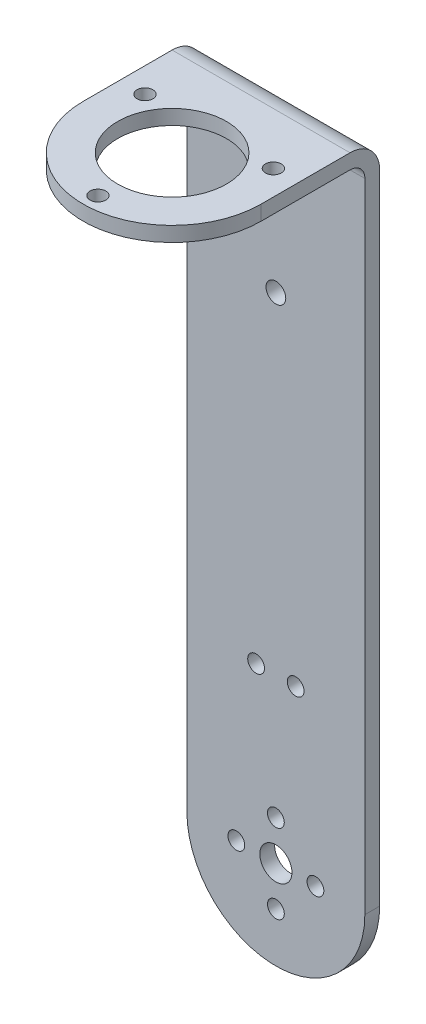
ISO-10303-21;
HEADER;
FILE_DESCRIPTION(('STEP AP214'),'2;1');
FILE_NAME('part.step','',(''),(''),'','','');
FILE_SCHEMA(('AUTOMOTIVE_DESIGN { 1 0 10303 214 1 1 1 1 }'));
ENDSEC;
DATA;
#1=APPLICATION_CONTEXT('core data for automotive mechanical design processes');
#2=APPLICATION_PROTOCOL_DEFINITION('international standard','automotive_design',2000,#1);
#3=PRODUCT_CONTEXT('',#1,'mechanical');
#4=PRODUCT('Part','Part','',(#3));
#5=PRODUCT_RELATED_PRODUCT_CATEGORY('part','',(#4));
#6=PRODUCT_DEFINITION_FORMATION('','',#4);
#7=PRODUCT_DEFINITION_CONTEXT('part definition',#1,'design');
#8=PRODUCT_DEFINITION('design','',#6,#7);
#9=PRODUCT_DEFINITION_SHAPE('','',#8);
#10=(LENGTH_UNIT() NAMED_UNIT(*) SI_UNIT(.MILLI.,.METRE.));
#11=(NAMED_UNIT(*) PLANE_ANGLE_UNIT() SI_UNIT($,.RADIAN.));
#12=(NAMED_UNIT(*) SI_UNIT($,.STERADIAN.) SOLID_ANGLE_UNIT());
#13=UNCERTAINTY_MEASURE_WITH_UNIT(LENGTH_MEASURE(1.E-05),#10,'distance_accuracy_value','');
#14=(GEOMETRIC_REPRESENTATION_CONTEXT(3) GLOBAL_UNCERTAINTY_ASSIGNED_CONTEXT((#13)) GLOBAL_UNIT_ASSIGNED_CONTEXT((#10,
#11,#12)) REPRESENTATION_CONTEXT('',''));
#15=CARTESIAN_POINT('',(0.,0.,0.));
#16=DIRECTION('',(0.,0.,1.));
#17=DIRECTION('',(1.,0.,0.));
#18=AXIS2_PLACEMENT_3D('',#15,#16,#17);
#19=CARTESIAN_POINT('',(0.,0.,3.));
#20=DIRECTION('',(0.,0.,-1.));
#21=DIRECTION('',(-1.,0.,0.));
#22=AXIS2_PLACEMENT_3D('',#19,#20,#21);
#23=PLANE('',#22);
#24=DIRECTION('',(0.,1.,0.));
#25=VECTOR('',#24,1.);
#26=CARTESIAN_POINT('',(18.,135.,3.));
#27=LINE('',#26,#25);
#28=CARTESIAN_POINT('',(18.,0.,3.));
#29=VERTEX_POINT('',#28);
#30=CARTESIAN_POINT('',(18.,129.,3.));
#31=VERTEX_POINT('',#30);
#32=EDGE_CURVE('E188',#29,#31,#27,.T.);
#33=ORIENTED_EDGE('',*,*,#32,.T.);
#34=DIRECTION('',(-1.,0.,0.));
#35=VECTOR('',#34,1.);
#36=CARTESIAN_POINT('',(0.,129.,3.));
#37=LINE('',#36,#35);
#38=CARTESIAN_POINT('',(-18.,129.,3.));
#39=VERTEX_POINT('',#38);
#40=EDGE_CURVE('E210',#31,#39,#37,.T.);
#41=ORIENTED_EDGE('',*,*,#40,.T.);
#42=DIRECTION('',(0.,-1.,0.));
#43=VECTOR('',#42,1.);
#44=CARTESIAN_POINT('',(-18.,0.,3.));
#45=LINE('',#44,#43);
#46=CARTESIAN_POINT('',(-18.,0.,3.));
#47=VERTEX_POINT('',#46);
#48=EDGE_CURVE('E192',#39,#47,#45,.T.);
#49=ORIENTED_EDGE('',*,*,#48,.T.);
#50=CARTESIAN_POINT('',(0.,0.,3.));
#51=DIRECTION('',(0.,0.,1.));
#52=DIRECTION('',(-1.,0.,0.));
#53=AXIS2_PLACEMENT_3D('',#50,#51,#52);
#54=CIRCLE('',#53,18.);
#55=EDGE_CURVE('E185',#47,#29,#54,.T.);
#56=ORIENTED_EDGE('',*,*,#55,.T.);
#57=EDGE_LOOP('',(#33,#41,#49,#56));
#58=FACE_BOUND('',#57,.T.);
#59=CARTESIAN_POINT('',(0.,0.,3.));
#60=DIRECTION('',(0.,0.,1.));
#61=DIRECTION('',(1.,0.,0.));
#62=AXIS2_PLACEMENT_3D('',#59,#60,#61);
#63=CIRCLE('',#62,3.25);
#64=CARTESIAN_POINT('',(3.25,0.,3.));
#65=VERTEX_POINT('',#64);
#66=EDGE_CURVE('E179',#65,#65,#63,.T.);
#67=ORIENTED_EDGE('',*,*,#66,.F.);
#68=EDGE_LOOP('',(#67));
#69=FACE_BOUND('',#68,.T.);
#70=CARTESIAN_POINT('',(-8.,0.,3.));
#71=DIRECTION('',(0.,0.,1.));
#72=DIRECTION('',(1.,0.,0.));
#73=AXIS2_PLACEMENT_3D('',#70,#71,#72);
#74=CIRCLE('',#73,1.7);
#75=CARTESIAN_POINT('',(-6.3,0.,3.));
#76=VERTEX_POINT('',#75);
#77=EDGE_CURVE('E173',#76,#76,#74,.T.);
#78=ORIENTED_EDGE('',*,*,#77,.F.);
#79=EDGE_LOOP('',(#78));
#80=FACE_BOUND('',#79,.T.);
#81=CARTESIAN_POINT('',(8.,0.,3.));
#82=DIRECTION('',(0.,0.,1.));
#83=DIRECTION('',(1.,0.,0.));
#84=AXIS2_PLACEMENT_3D('',#81,#82,#83);
#85=CIRCLE('',#84,1.7);
#86=CARTESIAN_POINT('',(9.7,0.,3.));
#87=VERTEX_POINT('',#86);
#88=EDGE_CURVE('E167',#87,#87,#85,.T.);
#89=ORIENTED_EDGE('',*,*,#88,.F.);
#90=EDGE_LOOP('',(#89));
#91=FACE_BOUND('',#90,.T.);
#92=CARTESIAN_POINT('',(0.,-8.,3.));
#93=DIRECTION('',(0.,0.,1.));
#94=DIRECTION('',(1.,0.,0.));
#95=AXIS2_PLACEMENT_3D('',#92,#93,#94);
#96=CIRCLE('',#95,1.7);
#97=CARTESIAN_POINT('',(1.7,-8.,3.));
#98=VERTEX_POINT('',#97);
#99=EDGE_CURVE('E161',#98,#98,#96,.T.);
#100=ORIENTED_EDGE('',*,*,#99,.F.);
#101=EDGE_LOOP('',(#100));
#102=FACE_BOUND('',#101,.T.);
#103=CARTESIAN_POINT('',(0.,8.,3.));
#104=DIRECTION('',(0.,0.,1.));
#105=DIRECTION('',(1.,0.,0.));
#106=AXIS2_PLACEMENT_3D('',#103,#104,#105);
#107=CIRCLE('',#106,1.7);
#108=CARTESIAN_POINT('',(1.7,8.,3.));
#109=VERTEX_POINT('',#108);
#110=EDGE_CURVE('E155',#109,#109,#107,.T.);
#111=ORIENTED_EDGE('',*,*,#110,.F.);
#112=EDGE_LOOP('',(#111));
#113=FACE_BOUND('',#112,.T.);
#114=CARTESIAN_POINT('',(-4.,33.,3.));
#115=DIRECTION('',(0.,0.,1.));
#116=DIRECTION('',(1.,0.,0.));
#117=AXIS2_PLACEMENT_3D('',#114,#115,#116);
#118=CIRCLE('',#117,1.7);
#119=CARTESIAN_POINT('',(-2.3,33.,3.));
#120=VERTEX_POINT('',#119);
#121=EDGE_CURVE('E149',#120,#120,#118,.T.);
#122=ORIENTED_EDGE('',*,*,#121,.F.);
#123=EDGE_LOOP('',(#122));
#124=FACE_BOUND('',#123,.T.);
#125=CARTESIAN_POINT('',(4.,33.,3.));
#126=DIRECTION('',(0.,0.,1.));
#127=DIRECTION('',(1.,0.,0.));
#128=AXIS2_PLACEMENT_3D('',#125,#126,#127);
#129=CIRCLE('',#128,1.7);
#130=CARTESIAN_POINT('',(5.7,33.,3.));
#131=VERTEX_POINT('',#130);
#132=EDGE_CURVE('E143',#131,#131,#129,.T.);
#133=ORIENTED_EDGE('',*,*,#132,.F.);
#134=EDGE_LOOP('',(#133));
#135=FACE_BOUND('',#134,.T.);
#136=CARTESIAN_POINT('',(0.,100.,3.));
#137=DIRECTION('',(0.,0.,1.));
#138=DIRECTION('',(1.,0.,0.));
#139=AXIS2_PLACEMENT_3D('',#136,#137,#138);
#140=CIRCLE('',#139,2.);
#141=CARTESIAN_POINT('',(2.,100.,3.));
#142=VERTEX_POINT('',#141);
#143=EDGE_CURVE('E137',#142,#142,#140,.T.);
#144=ORIENTED_EDGE('',*,*,#143,.F.);
#145=EDGE_LOOP('',(#144));
#146=FACE_BOUND('',#145,.T.);
#147=ADVANCED_FACE('F43',(#58,#69,#80,#91,#102,#113,#124,#135,#146),#23,.F.);
#148=CARTESIAN_POINT('',(0.,0.,0.));
#149=DIRECTION('',(0.,0.,-1.));
#150=DIRECTION('',(-1.,0.,0.));
#151=AXIS2_PLACEMENT_3D('',#148,#149,#150);
#152=PLANE('',#151);
#153=DIRECTION('',(0.,-1.,0.));
#154=VECTOR('',#153,1.);
#155=CARTESIAN_POINT('',(-18.,0.,0.));
#156=LINE('',#155,#154);
#157=CARTESIAN_POINT('',(-18.,129.,0.));
#158=VERTEX_POINT('',#157);
#159=CARTESIAN_POINT('',(-18.,0.,0.));
#160=VERTEX_POINT('',#159);
#161=EDGE_CURVE('E189',#158,#160,#156,.T.);
#162=ORIENTED_EDGE('',*,*,#161,.F.);
#163=DIRECTION('',(-1.,0.,0.));
#164=VECTOR('',#163,1.);
#165=CARTESIAN_POINT('',(18.,129.,0.));
#166=LINE('',#165,#164);
#167=CARTESIAN_POINT('',(18.,129.,0.));
#168=VERTEX_POINT('',#167);
#169=EDGE_CURVE('E51',#158,#168,#166,.F.);
#170=ORIENTED_EDGE('',*,*,#169,.T.);
#171=DIRECTION('',(0.,1.,0.));
#172=VECTOR('',#171,1.);
#173=CARTESIAN_POINT('',(18.,135.,0.));
#174=LINE('',#173,#172);
#175=CARTESIAN_POINT('',(18.,0.,0.));
#176=VERTEX_POINT('',#175);
#177=EDGE_CURVE('E197',#176,#168,#174,.T.);
#178=ORIENTED_EDGE('',*,*,#177,.F.);
#179=CARTESIAN_POINT('',(0.,0.,0.));
#180=DIRECTION('',(0.,0.,1.));
#181=DIRECTION('',(-1.,0.,0.));
#182=AXIS2_PLACEMENT_3D('',#179,#180,#181);
#183=CIRCLE('',#182,18.);
#184=EDGE_CURVE('E182',#160,#176,#183,.T.);
#185=ORIENTED_EDGE('',*,*,#184,.F.);
#186=EDGE_LOOP('',(#162,#170,#178,#185));
#187=FACE_BOUND('',#186,.T.);
#188=CARTESIAN_POINT('',(4.,33.,0.));
#189=DIRECTION('',(0.,0.,1.));
#190=DIRECTION('',(1.,0.,0.));
#191=AXIS2_PLACEMENT_3D('',#188,#189,#190);
#192=CIRCLE('',#191,1.7);
#193=CARTESIAN_POINT('',(5.7,33.,0.));
#194=VERTEX_POINT('',#193);
#195=EDGE_CURVE('E140',#194,#194,#192,.T.);
#196=ORIENTED_EDGE('',*,*,#195,.T.);
#197=EDGE_LOOP('',(#196));
#198=FACE_BOUND('',#197,.T.);
#199=CARTESIAN_POINT('',(0.,8.,0.));
#200=DIRECTION('',(0.,0.,1.));
#201=DIRECTION('',(1.,0.,0.));
#202=AXIS2_PLACEMENT_3D('',#199,#200,#201);
#203=CIRCLE('',#202,1.7);
#204=CARTESIAN_POINT('',(1.7,8.,0.));
#205=VERTEX_POINT('',#204);
#206=EDGE_CURVE('E152',#205,#205,#203,.T.);
#207=ORIENTED_EDGE('',*,*,#206,.T.);
#208=EDGE_LOOP('',(#207));
#209=FACE_BOUND('',#208,.T.);
#210=CARTESIAN_POINT('',(8.,0.,0.));
#211=DIRECTION('',(0.,0.,1.));
#212=DIRECTION('',(1.,0.,0.));
#213=AXIS2_PLACEMENT_3D('',#210,#211,#212);
#214=CIRCLE('',#213,1.7);
#215=CARTESIAN_POINT('',(9.7,0.,0.));
#216=VERTEX_POINT('',#215);
#217=EDGE_CURVE('E164',#216,#216,#214,.T.);
#218=ORIENTED_EDGE('',*,*,#217,.T.);
#219=EDGE_LOOP('',(#218));
#220=FACE_BOUND('',#219,.T.);
#221=CARTESIAN_POINT('',(0.,0.,0.));
#222=DIRECTION('',(0.,0.,1.));
#223=DIRECTION('',(1.,0.,0.));
#224=AXIS2_PLACEMENT_3D('',#221,#222,#223);
#225=CIRCLE('',#224,3.25);
#226=CARTESIAN_POINT('',(3.25,0.,0.));
#227=VERTEX_POINT('',#226);
#228=EDGE_CURVE('E176',#227,#227,#225,.T.);
#229=ORIENTED_EDGE('',*,*,#228,.T.);
#230=EDGE_LOOP('',(#229));
#231=FACE_BOUND('',#230,.T.);
#232=CARTESIAN_POINT('',(-8.,0.,0.));
#233=DIRECTION('',(0.,0.,1.));
#234=DIRECTION('',(1.,0.,0.));
#235=AXIS2_PLACEMENT_3D('',#232,#233,#234);
#236=CIRCLE('',#235,1.7);
#237=CARTESIAN_POINT('',(-6.3,0.,0.));
#238=VERTEX_POINT('',#237);
#239=EDGE_CURVE('E170',#238,#238,#236,.T.);
#240=ORIENTED_EDGE('',*,*,#239,.T.);
#241=EDGE_LOOP('',(#240));
#242=FACE_BOUND('',#241,.T.);
#243=CARTESIAN_POINT('',(0.,-8.,0.));
#244=DIRECTION('',(0.,0.,1.));
#245=DIRECTION('',(1.,0.,0.));
#246=AXIS2_PLACEMENT_3D('',#243,#244,#245);
#247=CIRCLE('',#246,1.7);
#248=CARTESIAN_POINT('',(1.7,-8.,0.));
#249=VERTEX_POINT('',#248);
#250=EDGE_CURVE('E158',#249,#249,#247,.T.);
#251=ORIENTED_EDGE('',*,*,#250,.T.);
#252=EDGE_LOOP('',(#251));
#253=FACE_BOUND('',#252,.T.);
#254=CARTESIAN_POINT('',(-4.,33.,0.));
#255=DIRECTION('',(0.,0.,1.));
#256=DIRECTION('',(1.,0.,0.));
#257=AXIS2_PLACEMENT_3D('',#254,#255,#256);
#258=CIRCLE('',#257,1.7);
#259=CARTESIAN_POINT('',(-2.3,33.,0.));
#260=VERTEX_POINT('',#259);
#261=EDGE_CURVE('E146',#260,#260,#258,.T.);
#262=ORIENTED_EDGE('',*,*,#261,.T.);
#263=EDGE_LOOP('',(#262));
#264=FACE_BOUND('',#263,.T.);
#265=CARTESIAN_POINT('',(0.,100.,0.));
#266=DIRECTION('',(0.,0.,1.));
#267=DIRECTION('',(1.,0.,0.));
#268=AXIS2_PLACEMENT_3D('',#265,#266,#267);
#269=CIRCLE('',#268,2.);
#270=CARTESIAN_POINT('',(2.,100.,0.));
#271=VERTEX_POINT('',#270);
#272=EDGE_CURVE('E135',#271,#271,#269,.T.);
#273=ORIENTED_EDGE('',*,*,#272,.T.);
#274=EDGE_LOOP('',(#273));
#275=FACE_BOUND('',#274,.T.);
#276=ADVANCED_FACE('F231',(#187,#198,#209,#220,#231,#242,#253,#264,#275),#152,.T.);
#277=CARTESIAN_POINT('',(0.,0.,3.));
#278=DIRECTION('',(0.,0.,-1.));
#279=DIRECTION('',(-1.,0.,0.));
#280=AXIS2_PLACEMENT_3D('',#277,#278,#279);
#281=CYLINDRICAL_SURFACE('',#280,18.);
#282=ORIENTED_EDGE('',*,*,#184,.T.);
#283=DIRECTION('',(0.,0.,-1.));
#284=VECTOR('',#283,1.);
#285=CARTESIAN_POINT('',(18.,0.,3.));
#286=LINE('',#285,#284);
#287=EDGE_CURVE('E207',#29,#176,#286,.T.);
#288=ORIENTED_EDGE('',*,*,#287,.F.);
#289=ORIENTED_EDGE('',*,*,#55,.F.);
#290=DIRECTION('',(0.,0.,-1.));
#291=VECTOR('',#290,1.);
#292=CARTESIAN_POINT('',(-18.,0.,3.));
#293=LINE('',#292,#291);
#294=EDGE_CURVE('E194',#47,#160,#293,.T.);
#295=ORIENTED_EDGE('',*,*,#294,.T.);
#296=EDGE_LOOP('',(#282,#288,#289,#295));
#297=FACE_BOUND('',#296,.T.);
#298=ADVANCED_FACE('F234',(#297),#281,.T.);
#299=CARTESIAN_POINT('',(18.,135.,3.));
#300=DIRECTION('',(-1.,0.,0.));
#301=DIRECTION('',(0.,0.,1.));
#302=AXIS2_PLACEMENT_3D('',#299,#300,#301);
#303=PLANE('',#302);
#304=ORIENTED_EDGE('',*,*,#177,.T.);
#305=CARTESIAN_POINT('',(18.,129.,6.));
#306=DIRECTION('',(-1.,0.,0.));
#307=DIRECTION('',(0.,0.,1.));
#308=AXIS2_PLACEMENT_3D('',#305,#306,#307);
#309=CIRCLE('',#308,6.);
#310=CARTESIAN_POINT('',(18.,135.,6.));
#311=VERTEX_POINT('',#310);
#312=EDGE_CURVE('E11',#168,#311,#309,.F.);
#313=ORIENTED_EDGE('',*,*,#312,.T.);
#314=DIRECTION('',(0.,0.,-1.));
#315=VECTOR('',#314,1.);
#316=CARTESIAN_POINT('',(18.,135.,3.));
#317=LINE('',#316,#315);
#318=CARTESIAN_POINT('',(18.,135.,24.));
#319=VERTEX_POINT('',#318);
#320=EDGE_CURVE('E204',#319,#311,#317,.T.);
#321=ORIENTED_EDGE('',*,*,#320,.F.);
#322=DIRECTION('',(0.,1.,0.));
#323=VECTOR('',#322,1.);
#324=CARTESIAN_POINT('',(18.,132.,24.));
#325=LINE('',#324,#323);
#326=CARTESIAN_POINT('',(18.,132.,24.));
#327=VERTEX_POINT('',#326);
#328=EDGE_CURVE('E123',#327,#319,#325,.T.);
#329=ORIENTED_EDGE('',*,*,#328,.F.);
#330=DIRECTION('',(0.,0.,-1.));
#331=VECTOR('',#330,1.);
#332=CARTESIAN_POINT('',(18.,132.,0.));
#333=LINE('',#332,#331);
#334=CARTESIAN_POINT('',(18.,132.,6.));
#335=VERTEX_POINT('',#334);
#336=EDGE_CURVE('E124',#327,#335,#333,.T.);
#337=ORIENTED_EDGE('',*,*,#336,.T.);
#338=CARTESIAN_POINT('',(18.,129.,6.));
#339=DIRECTION('',(-1.,0.,0.));
#340=DIRECTION('',(0.,0.,1.));
#341=AXIS2_PLACEMENT_3D('',#338,#339,#340);
#342=CIRCLE('',#341,3.);
#343=EDGE_CURVE('E216',#335,#31,#342,.T.);
#344=ORIENTED_EDGE('',*,*,#343,.T.);
#345=ORIENTED_EDGE('',*,*,#32,.F.);
#346=ORIENTED_EDGE('',*,*,#287,.T.);
#347=EDGE_LOOP('',(#304,#313,#321,#329,#337,#344,#345,#346));
#348=FACE_BOUND('',#347,.T.);
#349=ADVANCED_FACE('F228',(#348),#303,.F.);
#350=CARTESIAN_POINT('',(-18.,135.,3.));
#351=DIRECTION('',(0.,-1.,0.));
#352=DIRECTION('',(0.,0.,-1.));
#353=AXIS2_PLACEMENT_3D('',#350,#351,#352);
#354=PLANE('',#353);
#355=ORIENTED_EDGE('',*,*,#320,.T.);
#356=DIRECTION('',(-1.,0.,0.));
#357=VECTOR('',#356,1.);
#358=CARTESIAN_POINT('',(-18.,135.,6.));
#359=LINE('',#358,#357);
#360=CARTESIAN_POINT('',(-18.,135.,6.));
#361=VERTEX_POINT('',#360);
#362=EDGE_CURVE('E218',#311,#361,#359,.T.);
#363=ORIENTED_EDGE('',*,*,#362,.T.);
#364=DIRECTION('',(0.,0.,-1.));
#365=VECTOR('',#364,1.);
#366=CARTESIAN_POINT('',(-18.,135.,3.));
#367=LINE('',#366,#365);
#368=CARTESIAN_POINT('',(-18.,135.,24.));
#369=VERTEX_POINT('',#368);
#370=EDGE_CURVE('E202',#369,#361,#367,.T.);
#371=ORIENTED_EDGE('',*,*,#370,.F.);
#372=CARTESIAN_POINT('',(0.,135.,24.));
#373=DIRECTION('',(0.,1.,0.));
#374=DIRECTION('',(0.,0.,-1.));
#375=AXIS2_PLACEMENT_3D('',#372,#373,#374);
#376=CIRCLE('',#375,18.);
#377=EDGE_CURVE('E116',#369,#319,#376,.T.);
#378=ORIENTED_EDGE('',*,*,#377,.T.);
#379=EDGE_LOOP('',(#355,#363,#371,#378));
#380=FACE_BOUND('',#379,.T.);
#381=CARTESIAN_POINT('',(12.990381,135.,16.5));
#382=DIRECTION('',(0.,1.,0.));
#383=DIRECTION('',(0.,0.,1.));
#384=AXIS2_PLACEMENT_3D('',#381,#382,#383);
#385=CIRCLE('',#384,1.6);
#386=CARTESIAN_POINT('',(12.990381,135.,18.1));
#387=VERTEX_POINT('',#386);
#388=EDGE_CURVE('E466',#387,#387,#385,.T.);
#389=ORIENTED_EDGE('',*,*,#388,.F.);
#390=EDGE_LOOP('',(#389));
#391=FACE_BOUND('',#390,.T.);
#392=CARTESIAN_POINT('',(-12.990381,135.,16.5));
#393=DIRECTION('',(0.,1.,0.));
#394=DIRECTION('',(0.,0.,1.));
#395=AXIS2_PLACEMENT_3D('',#392,#393,#394);
#396=CIRCLE('',#395,1.6);
#397=CARTESIAN_POINT('',(-12.990381,135.,18.1));
#398=VERTEX_POINT('',#397);
#399=EDGE_CURVE('E465',#398,#398,#396,.T.);
#400=ORIENTED_EDGE('',*,*,#399,.F.);
#401=EDGE_LOOP('',(#400));
#402=FACE_BOUND('',#401,.T.);
#403=CARTESIAN_POINT('',(0.,135.,39.));
#404=DIRECTION('',(0.,1.,0.));
#405=DIRECTION('',(0.,0.,1.));
#406=AXIS2_PLACEMENT_3D('',#403,#404,#405);
#407=CIRCLE('',#406,1.6);
#408=CARTESIAN_POINT('',(0.,135.,40.6));
#409=VERTEX_POINT('',#408);
#410=EDGE_CURVE('E473',#409,#409,#407,.T.);
#411=ORIENTED_EDGE('',*,*,#410,.F.);
#412=EDGE_LOOP('',(#411));
#413=FACE_BOUND('',#412,.T.);
#414=CARTESIAN_POINT('',(0.,135.,24.));
#415=DIRECTION('',(0.,1.,0.));
#416=DIRECTION('',(0.,0.,1.));
#417=AXIS2_PLACEMENT_3D('',#414,#415,#416);
#418=CIRCLE('',#417,11.);
#419=CARTESIAN_POINT('',(0.,135.,35.));
#420=VERTEX_POINT('',#419);
#421=EDGE_CURVE('E476',#420,#420,#418,.T.);
#422=ORIENTED_EDGE('',*,*,#421,.F.);
#423=EDGE_LOOP('',(#422));
#424=FACE_BOUND('',#423,.T.);
#425=ADVANCED_FACE('F223',(#380,#391,#402,#413,#424),#354,.F.);
#426=CARTESIAN_POINT('',(-18.,0.,3.));
#427=DIRECTION('',(1.,0.,0.));
#428=DIRECTION('',(0.,0.,-1.));
#429=AXIS2_PLACEMENT_3D('',#426,#427,#428);
#430=PLANE('',#429);
#431=ORIENTED_EDGE('',*,*,#370,.T.);
#432=CARTESIAN_POINT('',(-18.,129.,6.));
#433=DIRECTION('',(1.,0.,0.));
#434=DIRECTION('',(0.,0.,-1.));
#435=AXIS2_PLACEMENT_3D('',#432,#433,#434);
#436=CIRCLE('',#435,6.);
#437=EDGE_CURVE('E65',#361,#158,#436,.F.);
#438=ORIENTED_EDGE('',*,*,#437,.T.);
#439=ORIENTED_EDGE('',*,*,#161,.T.);
#440=ORIENTED_EDGE('',*,*,#294,.F.);
#441=ORIENTED_EDGE('',*,*,#48,.F.);
#442=CARTESIAN_POINT('',(-18.,129.,6.));
#443=DIRECTION('',(1.,0.,0.));
#444=DIRECTION('',(0.,0.,-1.));
#445=AXIS2_PLACEMENT_3D('',#442,#443,#444);
#446=CIRCLE('',#445,3.);
#447=CARTESIAN_POINT('',(-18.,132.,6.));
#448=VERTEX_POINT('',#447);
#449=EDGE_CURVE('E111',#39,#448,#446,.T.);
#450=ORIENTED_EDGE('',*,*,#449,.T.);
#451=DIRECTION('',(0.,0.,1.));
#452=VECTOR('',#451,1.);
#453=CARTESIAN_POINT('',(-18.,132.,24.));
#454=LINE('',#453,#452);
#455=CARTESIAN_POINT('',(-18.,132.,24.));
#456=VERTEX_POINT('',#455);
#457=EDGE_CURVE('E105',#448,#456,#454,.T.);
#458=ORIENTED_EDGE('',*,*,#457,.T.);
#459=DIRECTION('',(0.,1.,0.));
#460=VECTOR('',#459,1.);
#461=CARTESIAN_POINT('',(-18.,132.,24.));
#462=LINE('',#461,#460);
#463=EDGE_CURVE('E108',#456,#369,#462,.T.);
#464=ORIENTED_EDGE('',*,*,#463,.T.);
#465=EDGE_LOOP('',(#431,#438,#439,#440,#441,#450,#458,#464));
#466=FACE_BOUND('',#465,.T.);
#467=ADVANCED_FACE('F107',(#466),#430,.F.);
#468=CARTESIAN_POINT('',(0.,0.,3.));
#469=DIRECTION('',(0.,0.,-1.));
#470=DIRECTION('',(-1.,0.,0.));
#471=AXIS2_PLACEMENT_3D('',#468,#469,#470);
#472=CYLINDRICAL_SURFACE('',#471,3.25);
#473=ORIENTED_EDGE('',*,*,#66,.T.);
#474=EDGE_LOOP('',(#473));
#475=FACE_BOUND('',#474,.T.);
#476=ORIENTED_EDGE('',*,*,#228,.F.);
#477=EDGE_LOOP('',(#476));
#478=FACE_BOUND('',#477,.T.);
#479=ADVANCED_FACE('F261',(#475,#478),#472,.F.);
#480=CARTESIAN_POINT('',(-8.,0.,3.));
#481=DIRECTION('',(0.,0.,-1.));
#482=DIRECTION('',(-1.,0.,0.));
#483=AXIS2_PLACEMENT_3D('',#480,#481,#482);
#484=CYLINDRICAL_SURFACE('',#483,1.7);
#485=ORIENTED_EDGE('',*,*,#77,.T.);
#486=EDGE_LOOP('',(#485));
#487=FACE_BOUND('',#486,.T.);
#488=ORIENTED_EDGE('',*,*,#239,.F.);
#489=EDGE_LOOP('',(#488));
#490=FACE_BOUND('',#489,.T.);
#491=ADVANCED_FACE('F281',(#487,#490),#484,.F.);
#492=CARTESIAN_POINT('',(8.,0.,3.));
#493=DIRECTION('',(0.,0.,-1.));
#494=DIRECTION('',(-1.,0.,0.));
#495=AXIS2_PLACEMENT_3D('',#492,#493,#494);
#496=CYLINDRICAL_SURFACE('',#495,1.7);
#497=ORIENTED_EDGE('',*,*,#88,.T.);
#498=EDGE_LOOP('',(#497));
#499=FACE_BOUND('',#498,.T.);
#500=ORIENTED_EDGE('',*,*,#217,.F.);
#501=EDGE_LOOP('',(#500));
#502=FACE_BOUND('',#501,.T.);
#503=ADVANCED_FACE('F290',(#499,#502),#496,.F.);
#504=CARTESIAN_POINT('',(0.,-8.,3.));
#505=DIRECTION('',(0.,0.,-1.));
#506=DIRECTION('',(-1.,0.,0.));
#507=AXIS2_PLACEMENT_3D('',#504,#505,#506);
#508=CYLINDRICAL_SURFACE('',#507,1.7);
#509=ORIENTED_EDGE('',*,*,#99,.T.);
#510=EDGE_LOOP('',(#509));
#511=FACE_BOUND('',#510,.T.);
#512=ORIENTED_EDGE('',*,*,#250,.F.);
#513=EDGE_LOOP('',(#512));
#514=FACE_BOUND('',#513,.T.);
#515=ADVANCED_FACE('F298',(#511,#514),#508,.F.);
#516=CARTESIAN_POINT('',(0.,8.,3.));
#517=DIRECTION('',(0.,0.,-1.));
#518=DIRECTION('',(-1.,0.,0.));
#519=AXIS2_PLACEMENT_3D('',#516,#517,#518);
#520=CYLINDRICAL_SURFACE('',#519,1.7);
#521=ORIENTED_EDGE('',*,*,#110,.T.);
#522=EDGE_LOOP('',(#521));
#523=FACE_BOUND('',#522,.T.);
#524=ORIENTED_EDGE('',*,*,#206,.F.);
#525=EDGE_LOOP('',(#524));
#526=FACE_BOUND('',#525,.T.);
#527=ADVANCED_FACE('F307',(#523,#526),#520,.F.);
#528=CARTESIAN_POINT('',(-4.,33.,3.));
#529=DIRECTION('',(0.,0.,-1.));
#530=DIRECTION('',(-1.,0.,0.));
#531=AXIS2_PLACEMENT_3D('',#528,#529,#530);
#532=CYLINDRICAL_SURFACE('',#531,1.7);
#533=ORIENTED_EDGE('',*,*,#121,.T.);
#534=EDGE_LOOP('',(#533));
#535=FACE_BOUND('',#534,.T.);
#536=ORIENTED_EDGE('',*,*,#261,.F.);
#537=EDGE_LOOP('',(#536));
#538=FACE_BOUND('',#537,.T.);
#539=ADVANCED_FACE('F316',(#535,#538),#532,.F.);
#540=CARTESIAN_POINT('',(4.,33.,3.));
#541=DIRECTION('',(0.,0.,-1.));
#542=DIRECTION('',(-1.,0.,0.));
#543=AXIS2_PLACEMENT_3D('',#540,#541,#542);
#544=CYLINDRICAL_SURFACE('',#543,1.7);
#545=ORIENTED_EDGE('',*,*,#132,.T.);
#546=EDGE_LOOP('',(#545));
#547=FACE_BOUND('',#546,.T.);
#548=ORIENTED_EDGE('',*,*,#195,.F.);
#549=EDGE_LOOP('',(#548));
#550=FACE_BOUND('',#549,.T.);
#551=ADVANCED_FACE('F325',(#547,#550),#544,.F.);
#552=CARTESIAN_POINT('',(0.,100.,3.));
#553=DIRECTION('',(0.,0.,-1.));
#554=DIRECTION('',(-1.,0.,0.));
#555=AXIS2_PLACEMENT_3D('',#552,#553,#554);
#556=CYLINDRICAL_SURFACE('',#555,2.);
#557=ORIENTED_EDGE('',*,*,#143,.T.);
#558=EDGE_LOOP('',(#557));
#559=FACE_BOUND('',#558,.T.);
#560=ORIENTED_EDGE('',*,*,#272,.F.);
#561=EDGE_LOOP('',(#560));
#562=FACE_BOUND('',#561,.T.);
#563=ADVANCED_FACE('F334',(#559,#562),#556,.F.);
#564=CARTESIAN_POINT('',(0.,132.,24.));
#565=DIRECTION('',(0.,-1.,0.));
#566=DIRECTION('',(0.,0.,-1.));
#567=AXIS2_PLACEMENT_3D('',#564,#565,#566);
#568=PLANE('',#567);
#569=CARTESIAN_POINT('',(0.,132.,24.));
#570=DIRECTION('',(0.,1.,0.));
#571=DIRECTION('',(0.,0.,1.));
#572=AXIS2_PLACEMENT_3D('',#569,#570,#571);
#573=CIRCLE('',#572,11.);
#574=CARTESIAN_POINT('',(0.,132.,35.));
#575=VERTEX_POINT('',#574);
#576=EDGE_CURVE('E134',#575,#575,#573,.T.);
#577=ORIENTED_EDGE('',*,*,#576,.T.);
#578=EDGE_LOOP('',(#577));
#579=FACE_BOUND('',#578,.T.);
#580=CARTESIAN_POINT('',(0.,132.,39.));
#581=DIRECTION('',(0.,1.,0.));
#582=DIRECTION('',(0.,0.,1.));
#583=AXIS2_PLACEMENT_3D('',#580,#581,#582);
#584=CIRCLE('',#583,1.6);
#585=CARTESIAN_POINT('',(0.,132.,40.6));
#586=VERTEX_POINT('',#585);
#587=EDGE_CURVE('E457',#586,#586,#584,.T.);
#588=ORIENTED_EDGE('',*,*,#587,.T.);
#589=EDGE_LOOP('',(#588));
#590=FACE_BOUND('',#589,.T.);
#591=CARTESIAN_POINT('',(-12.990381,132.,16.5));
#592=DIRECTION('',(0.,1.,0.));
#593=DIRECTION('',(0.,0.,1.));
#594=AXIS2_PLACEMENT_3D('',#591,#592,#593);
#595=CIRCLE('',#594,1.6);
#596=CARTESIAN_POINT('',(-12.990381,132.,18.1));
#597=VERTEX_POINT('',#596);
#598=EDGE_CURVE('E461',#597,#597,#595,.T.);
#599=ORIENTED_EDGE('',*,*,#598,.T.);
#600=EDGE_LOOP('',(#599));
#601=FACE_BOUND('',#600,.T.);
#602=CARTESIAN_POINT('',(12.990381,132.,16.5));
#603=DIRECTION('',(0.,1.,0.));
#604=DIRECTION('',(0.,0.,1.));
#605=AXIS2_PLACEMENT_3D('',#602,#603,#604);
#606=CIRCLE('',#605,1.6);
#607=CARTESIAN_POINT('',(12.990381,132.,18.1));
#608=VERTEX_POINT('',#607);
#609=EDGE_CURVE('E464',#608,#608,#606,.T.);
#610=ORIENTED_EDGE('',*,*,#609,.T.);
#611=EDGE_LOOP('',(#610));
#612=FACE_BOUND('',#611,.T.);
#613=ORIENTED_EDGE('',*,*,#457,.F.);
#614=DIRECTION('',(-1.,0.,0.));
#615=VECTOR('',#614,1.);
#616=CARTESIAN_POINT('',(0.,132.,6.));
#617=LINE('',#616,#615);
#618=EDGE_CURVE('E213',#448,#335,#617,.F.);
#619=ORIENTED_EDGE('',*,*,#618,.T.);
#620=ORIENTED_EDGE('',*,*,#336,.F.);
#621=CARTESIAN_POINT('',(0.,132.,24.));
#622=DIRECTION('',(0.,1.,0.));
#623=DIRECTION('',(0.,0.,-1.));
#624=AXIS2_PLACEMENT_3D('',#621,#622,#623);
#625=CIRCLE('',#624,18.);
#626=EDGE_CURVE('E115',#456,#327,#625,.T.);
#627=ORIENTED_EDGE('',*,*,#626,.F.);
#628=EDGE_LOOP('',(#613,#619,#620,#627));
#629=FACE_BOUND('',#628,.T.);
#630=ADVANCED_FACE('F127',(#579,#590,#601,#612,#629),#568,.T.);
#631=CARTESIAN_POINT('',(0.,132.,24.));
#632=DIRECTION('',(0.,1.,0.));
#633=DIRECTION('',(0.,0.,1.));
#634=AXIS2_PLACEMENT_3D('',#631,#632,#633);
#635=CYLINDRICAL_SURFACE('',#634,18.);
#636=ORIENTED_EDGE('',*,*,#377,.F.);
#637=ORIENTED_EDGE('',*,*,#463,.F.);
#638=ORIENTED_EDGE('',*,*,#626,.T.);
#639=ORIENTED_EDGE('',*,*,#328,.T.);
#640=EDGE_LOOP('',(#636,#637,#638,#639));
#641=FACE_BOUND('',#640,.T.);
#642=ADVANCED_FACE('F120',(#641),#635,.T.);
#643=CARTESIAN_POINT('',(0.,132.,24.));
#644=DIRECTION('',(0.,1.,0.));
#645=DIRECTION('',(0.,0.,1.));
#646=AXIS2_PLACEMENT_3D('',#643,#644,#645);
#647=CYLINDRICAL_SURFACE('',#646,11.);
#648=ORIENTED_EDGE('',*,*,#576,.F.);
#649=EDGE_LOOP('',(#648));
#650=FACE_BOUND('',#649,.T.);
#651=ORIENTED_EDGE('',*,*,#421,.T.);
#652=EDGE_LOOP('',(#651));
#653=FACE_BOUND('',#652,.T.);
#654=ADVANCED_FACE('F352',(#650,#653),#647,.F.);
#655=CARTESIAN_POINT('',(0.,132.,39.));
#656=DIRECTION('',(0.,1.,0.));
#657=DIRECTION('',(0.,0.,1.));
#658=AXIS2_PLACEMENT_3D('',#655,#656,#657);
#659=CYLINDRICAL_SURFACE('',#658,1.6);
#660=ORIENTED_EDGE('',*,*,#587,.F.);
#661=EDGE_LOOP('',(#660));
#662=FACE_BOUND('',#661,.T.);
#663=ORIENTED_EDGE('',*,*,#410,.T.);
#664=EDGE_LOOP('',(#663));
#665=FACE_BOUND('',#664,.T.);
#666=ADVANCED_FACE('F361',(#662,#665),#659,.F.);
#667=CARTESIAN_POINT('',(-12.990381,132.,16.5));
#668=DIRECTION('',(0.,1.,0.));
#669=DIRECTION('',(0.,0.,1.));
#670=AXIS2_PLACEMENT_3D('',#667,#668,#669);
#671=CYLINDRICAL_SURFACE('',#670,1.6);
#672=ORIENTED_EDGE('',*,*,#598,.F.);
#673=EDGE_LOOP('',(#672));
#674=FACE_BOUND('',#673,.T.);
#675=ORIENTED_EDGE('',*,*,#399,.T.);
#676=EDGE_LOOP('',(#675));
#677=FACE_BOUND('',#676,.T.);
#678=ADVANCED_FACE('F251',(#674,#677),#671,.F.);
#679=CARTESIAN_POINT('',(12.990381,132.,16.5));
#680=DIRECTION('',(0.,1.,0.));
#681=DIRECTION('',(0.,0.,1.));
#682=AXIS2_PLACEMENT_3D('',#679,#680,#681);
#683=CYLINDRICAL_SURFACE('',#682,1.6);
#684=ORIENTED_EDGE('',*,*,#609,.F.);
#685=EDGE_LOOP('',(#684));
#686=FACE_BOUND('',#685,.T.);
#687=ORIENTED_EDGE('',*,*,#388,.T.);
#688=EDGE_LOOP('',(#687));
#689=FACE_BOUND('',#688,.T.);
#690=ADVANCED_FACE('F244',(#686,#689),#683,.F.);
#691=CARTESIAN_POINT('',(0.,129.,6.));
#692=DIRECTION('',(-1.,0.,0.));
#693=DIRECTION('',(0.,0.,1.));
#694=AXIS2_PLACEMENT_3D('',#691,#692,#693);
#695=CYLINDRICAL_SURFACE('',#694,3.);
#696=ORIENTED_EDGE('',*,*,#343,.F.);
#697=ORIENTED_EDGE('',*,*,#618,.F.);
#698=ORIENTED_EDGE('',*,*,#449,.F.);
#699=ORIENTED_EDGE('',*,*,#40,.F.);
#700=EDGE_LOOP('',(#696,#697,#698,#699));
#701=FACE_BOUND('',#700,.T.);
#702=ADVANCED_FACE('F242',(#701),#695,.F.);
#703=CARTESIAN_POINT('',(-18.,129.,6.));
#704=DIRECTION('',(1.,0.,0.));
#705=DIRECTION('',(0.,0.,-1.));
#706=AXIS2_PLACEMENT_3D('',#703,#704,#705);
#707=CYLINDRICAL_SURFACE('',#706,6.);
#708=ORIENTED_EDGE('',*,*,#312,.F.);
#709=ORIENTED_EDGE('',*,*,#169,.F.);
#710=ORIENTED_EDGE('',*,*,#437,.F.);
#711=ORIENTED_EDGE('',*,*,#362,.F.);
#712=EDGE_LOOP('',(#708,#709,#710,#711));
#713=FACE_BOUND('',#712,.T.);
#714=ADVANCED_FACE('F45',(#713),#707,.T.);
#715=CLOSED_SHELL('',(#147,#276,#298,#349,#425,#467,#479,#491,#503,#515,#527,#539,#551,#563,
#630,#642,#654,#666,#678,#690,#702,#714));
#716=MANIFOLD_SOLID_BREP('B2',#715);
#717=ADVANCED_BREP_SHAPE_REPRESENTATION('',(#18,#716),#14);
#718=SHAPE_DEFINITION_REPRESENTATION(#9,#717);
ENDSEC;
END-ISO-10303-21;
